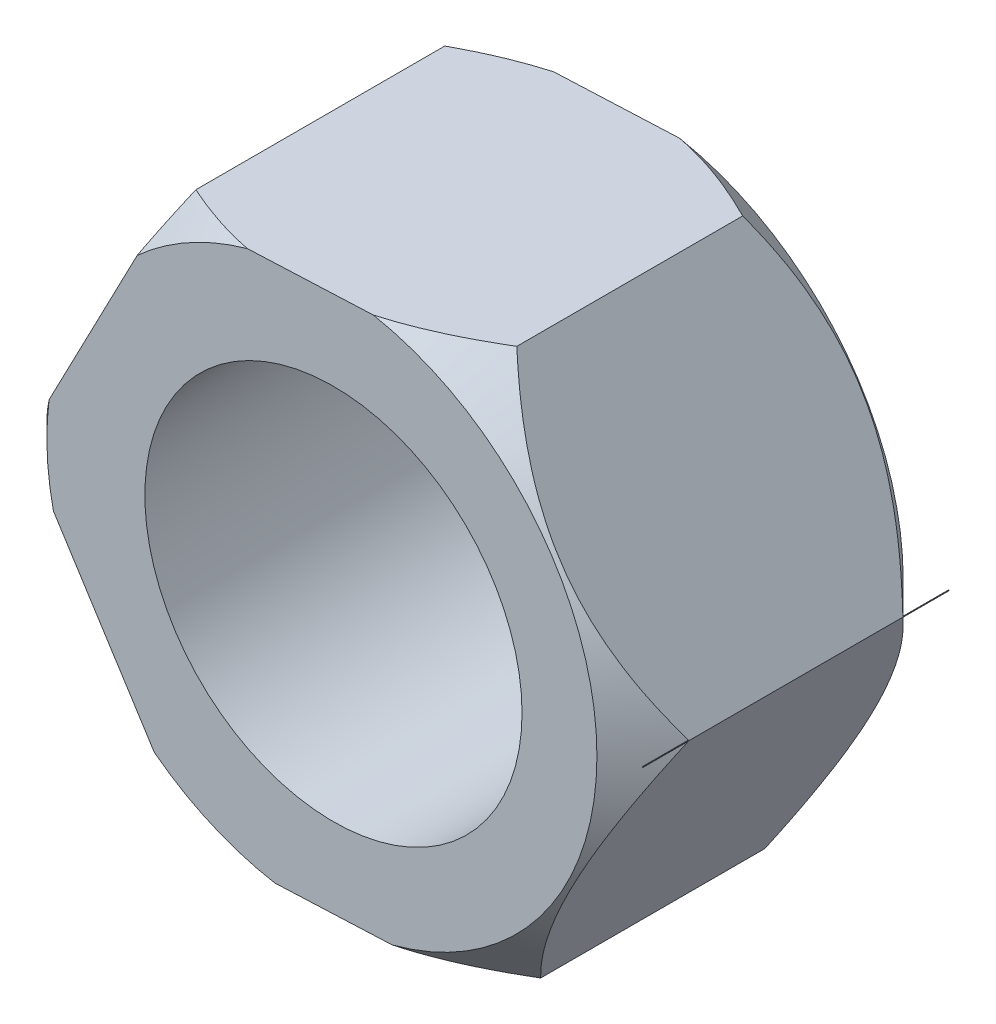
ISO-10303-21;
HEADER;
FILE_DESCRIPTION(('STEP AP214'),'2;1');
FILE_NAME('part.step','',(''),(''),'','','');
FILE_SCHEMA(('AUTOMOTIVE_DESIGN { 1 0 10303 214 1 1 1 1 }'));
ENDSEC;
DATA;
#1=APPLICATION_CONTEXT('core data for automotive mechanical design processes');
#2=APPLICATION_PROTOCOL_DEFINITION('international standard','automotive_design',2000,#1);
#3=PRODUCT_CONTEXT('',#1,'mechanical');
#4=PRODUCT('Part','Part','',(#3));
#5=PRODUCT_RELATED_PRODUCT_CATEGORY('part','',(#4));
#6=PRODUCT_DEFINITION_FORMATION('','',#4);
#7=PRODUCT_DEFINITION_CONTEXT('part definition',#1,'design');
#8=PRODUCT_DEFINITION('design','',#6,#7);
#9=PRODUCT_DEFINITION_SHAPE('','',#8);
#10=(LENGTH_UNIT() NAMED_UNIT(*) SI_UNIT(.MILLI.,.METRE.));
#11=(NAMED_UNIT(*) PLANE_ANGLE_UNIT() SI_UNIT($,.RADIAN.));
#12=(NAMED_UNIT(*) SI_UNIT($,.STERADIAN.) SOLID_ANGLE_UNIT());
#13=UNCERTAINTY_MEASURE_WITH_UNIT(LENGTH_MEASURE(1.E-05),#10,'distance_accuracy_value','');
#14=(GEOMETRIC_REPRESENTATION_CONTEXT(3) GLOBAL_UNCERTAINTY_ASSIGNED_CONTEXT((#13)) GLOBAL_UNIT_ASSIGNED_CONTEXT((#10,
#11,#12)) REPRESENTATION_CONTEXT('',''));
#15=CARTESIAN_POINT('',(0.,0.,0.));
#16=DIRECTION('',(0.,0.,1.));
#17=DIRECTION('',(1.,0.,0.));
#18=AXIS2_PLACEMENT_3D('',#15,#16,#17);
#19=CARTESIAN_POINT('',(0.,0.,0.2));
#20=DIRECTION('',(0.,0.,1.));
#21=DIRECTION('',(1.,0.,0.));
#22=AXIS2_PLACEMENT_3D('',#19,#20,#21);
#23=PLANE('',#22);
#24=DIRECTION('',(-0.536795426051576,0.843712433575627,0.));
#25=VECTOR('',#24,1.);
#26=CARTESIAN_POINT('',(0.202072594216369,0.00870167620666327,0.2));
#27=LINE('',#26,#25);
#28=CARTESIAN_POINT('',(0.202072594216369,0.00870167620666327,0.2));
#29=VERTEX_POINT('',#28);
#30=CARTESIAN_POINT('',(0.201879033774588,0.00900590635366816,0.2));
#31=VERTEX_POINT('',#30);
#32=EDGE_CURVE('E206',#29,#31,#27,.T.);
#33=ORIENTED_EDGE('',*,*,#32,.T.);
#34=CARTESIAN_POINT('',(-0.00753587265047697,0.,0.2));
#35=DIRECTION('',(0.,0.,-1.));
#36=DIRECTION('',(-1.,0.,0.));
#37=AXIS2_PLACEMENT_3D('',#34,#35,#36);
#38=CIRCLE('',#37,0.209608466866846);
#39=CARTESIAN_POINT('',(0.201905005529297,0.00838021059132095,0.2));
#40=VERTEX_POINT('',#39);
#41=EDGE_CURVE('E379',#31,#40,#38,.T.);
#42=ORIENTED_EDGE('',*,*,#41,.T.);
#43=DIRECTION('',(0.462278687939496,0.886734692383769,0.));
#44=VECTOR('',#43,1.);
#45=CARTESIAN_POINT('',(0.108572169758661,-0.170649161896668,0.2));
#46=LINE('',#45,#44);
#47=EDGE_CURVE('E204',#40,#29,#46,.T.);
#48=ORIENTED_EDGE('',*,*,#47,.T.);
#49=EDGE_LOOP('',(#33,#42,#48));
#50=FACE_BOUND('',#49,.T.);
#51=ADVANCED_FACE('F36',(#50),#23,.T.);
#52=CARTESIAN_POINT('',(0.,0.,0.2));
#53=DIRECTION('',(0.,0.,1.));
#54=DIRECTION('',(1.,0.,0.));
#55=AXIS2_PLACEMENT_3D('',#52,#53,#54);
#56=CIRCLE('',#55,0.123170064862239);
#57=CARTESIAN_POINT('',(0.123170064862239,0.,0.2));
#58=VERTEX_POINT('',#57);
#59=EDGE_CURVE('E214',#58,#58,#56,.T.);
#60=ORIENTED_EDGE('',*,*,#59,.F.);
#61=EDGE_LOOP('',(#60));
#62=FACE_BOUND('',#61,.T.);
#63=DIRECTION('',(-0.999074113991072,-0.0430222588081423,0.));
#64=VECTOR('',#63,1.);
#65=CARTESIAN_POINT('',(0.0935004244577075,0.179350838103332,0.2));
#66=LINE('',#65,#64);
#67=CARTESIAN_POINT('',(0.0260245099685869,0.176445181540106,0.2));
#68=VERTEX_POINT('',#67);
#69=CARTESIAN_POINT('',(-0.0561401040547646,0.17290699829636,0.2));
#70=VERTEX_POINT('',#69);
#71=EDGE_CURVE('E194',#68,#70,#66,.T.);
#72=ORIENTED_EDGE('',*,*,#71,.T.);
#73=CARTESIAN_POINT('',(-0.00753587265047697,0.,0.2));
#74=DIRECTION('',(0.,0.,-1.));
#75=DIRECTION('',(-1.,0.,0.));
#76=AXIS2_PLACEMENT_3D('',#73,#74,#75);
#77=CIRCLE('',#76,0.179608466866846);
#78=CARTESIAN_POINT('',(-0.128160880075446,0.133074448914828,0.2));
#79=VERTEX_POINT('',#78);
#80=EDGE_CURVE('E179',#79,#70,#77,.T.);
#81=ORIENTED_EDGE('',*,*,#80,.F.);
#82=DIRECTION('',(-0.462278687939496,-0.886734692383769,0.));
#83=VECTOR('',#82,1.);
#84=CARTESIAN_POINT('',(-0.108572169758661,0.170649161896668,0.2));
#85=LINE('',#84,#83);
#86=CARTESIAN_POINT('',(-0.185704739763984,0.0226948487932463,0.2));
#87=VERTEX_POINT('',#86);
#88=EDGE_CURVE('E185',#79,#87,#85,.T.);
#89=ORIENTED_EDGE('',*,*,#88,.T.);
#90=CARTESIAN_POINT('',(-0.18289283517902,-0.0388476133503999,0.2));
#91=VERTEX_POINT('',#90);
#92=EDGE_CURVE('E167',#91,#87,#77,.T.);
#93=ORIENTED_EDGE('',*,*,#92,.F.);
#94=DIRECTION('',(0.536795426051576,-0.843712433575627,0.));
#95=VECTOR('',#94,1.);
#96=CARTESIAN_POINT('',(-0.202072594216369,-0.0087016762066633,0.2));
#97=LINE('',#96,#95);
#98=CARTESIAN_POINT('',(-0.117023096796865,-0.14237889281413,0.2));
#99=VERTEX_POINT('',#98);
#100=EDGE_CURVE('E193',#91,#99,#97,.T.);
#101=ORIENTED_EDGE('',*,*,#100,.T.);
#102=CARTESIAN_POINT('',(-0.038209328579222,-0.176969885776214,0.2));
#103=VERTEX_POINT('',#102);
#104=EDGE_CURVE('E177',#103,#99,#77,.T.);
#105=ORIENTED_EDGE('',*,*,#104,.F.);
#106=DIRECTION('',(0.999074113991072,0.0430222588081422,0.));
#107=VECTOR('',#106,1.);
#108=CARTESIAN_POINT('',(-0.0935004244577075,-0.179350838103332,0.2));
#109=LINE('',#108,#107);
#110=CARTESIAN_POINT('',(0.0382372250949524,-0.17367793438732,0.2));
#111=VERTEX_POINT('',#110);
#112=EDGE_CURVE('E196',#103,#111,#109,.T.);
#113=ORIENTED_EDGE('',*,*,#112,.T.);
#114=EDGE_CURVE('E387',#68,#111,#77,.T.);
#115=ORIENTED_EDGE('',*,*,#114,.F.);
#116=EDGE_LOOP('',(#72,#81,#89,#93,#101,#105,#113,#115));
#117=FACE_BOUND('',#116,.T.);
#118=ADVANCED_FACE('F192',(#62,#117),#23,.T.);
#119=CARTESIAN_POINT('',(0.,0.,0.));
#120=DIRECTION('',(0.,0.,1.));
#121=DIRECTION('',(1.,0.,0.));
#122=AXIS2_PLACEMENT_3D('',#119,#120,#121);
#123=PLANE('',#122);
#124=CARTESIAN_POINT('',(-0.00753587265047697,0.,0.));
#125=DIRECTION('',(0.,0.,-1.));
#126=DIRECTION('',(-1.,0.,0.));
#127=AXIS2_PLACEMENT_3D('',#124,#125,#126);
#128=CIRCLE('',#127,0.179608466866846);
#129=CARTESIAN_POINT('',(-0.128160880075446,0.133074448914828,0.));
#130=VERTEX_POINT('',#129);
#131=CARTESIAN_POINT('',(-0.0561401040547646,0.17290699829636,0.));
#132=VERTEX_POINT('',#131);
#133=EDGE_CURVE('E66',#130,#132,#128,.T.);
#134=ORIENTED_EDGE('',*,*,#133,.T.);
#135=DIRECTION('',(-0.999074113991072,-0.0430222588081423,0.));
#136=VECTOR('',#135,1.);
#137=CARTESIAN_POINT('',(0.0935004244577075,0.179350838103332,0.));
#138=LINE('',#137,#136);
#139=CARTESIAN_POINT('',(0.0260245099685869,0.176445181540106,0.));
#140=VERTEX_POINT('',#139);
#141=EDGE_CURVE('E210',#140,#132,#138,.T.);
#142=ORIENTED_EDGE('',*,*,#141,.F.);
#143=CARTESIAN_POINT('',(0.0382372250949524,-0.17367793438732,0.));
#144=VERTEX_POINT('',#143);
#145=EDGE_CURVE('E364',#140,#144,#128,.T.);
#146=ORIENTED_EDGE('',*,*,#145,.T.);
#147=DIRECTION('',(0.999074113991072,0.0430222588081422,0.));
#148=VECTOR('',#147,1.);
#149=CARTESIAN_POINT('',(-0.0935004244577075,-0.179350838103332,0.));
#150=LINE('',#149,#148);
#151=CARTESIAN_POINT('',(-0.038209328579222,-0.176969885776214,0.));
#152=VERTEX_POINT('',#151);
#153=EDGE_CURVE('E220',#152,#144,#150,.T.);
#154=ORIENTED_EDGE('',*,*,#153,.F.);
#155=CARTESIAN_POINT('',(-0.117023096796865,-0.14237889281413,0.));
#156=VERTEX_POINT('',#155);
#157=EDGE_CURVE('E371',#152,#156,#128,.T.);
#158=ORIENTED_EDGE('',*,*,#157,.T.);
#159=DIRECTION('',(0.536795426051576,-0.843712433575627,0.));
#160=VECTOR('',#159,1.);
#161=CARTESIAN_POINT('',(-0.202072594216369,-0.0087016762066633,0.));
#162=LINE('',#161,#160);
#163=CARTESIAN_POINT('',(-0.18289283517902,-0.0388476133503999,0.));
#164=VERTEX_POINT('',#163);
#165=EDGE_CURVE('E217',#164,#156,#162,.T.);
#166=ORIENTED_EDGE('',*,*,#165,.F.);
#167=CARTESIAN_POINT('',(-0.185704739763984,0.0226948487932463,0.));
#168=VERTEX_POINT('',#167);
#169=EDGE_CURVE('E366',#164,#168,#128,.T.);
#170=ORIENTED_EDGE('',*,*,#169,.T.);
#171=DIRECTION('',(-0.462278687939496,-0.886734692383769,0.));
#172=VECTOR('',#171,1.);
#173=CARTESIAN_POINT('',(-0.108572169758661,0.170649161896668,0.));
#174=LINE('',#173,#172);
#175=EDGE_CURVE('E213',#130,#168,#174,.T.);
#176=ORIENTED_EDGE('',*,*,#175,.F.);
#177=EDGE_LOOP('',(#134,#142,#146,#154,#158,#166,#170,#176));
#178=FACE_BOUND('',#177,.T.);
#179=CARTESIAN_POINT('',(0.,0.,0.));
#180=DIRECTION('',(0.,0.,1.));
#181=DIRECTION('',(1.,0.,0.));
#182=AXIS2_PLACEMENT_3D('',#179,#180,#181);
#183=CIRCLE('',#182,0.123170064862239);
#184=CARTESIAN_POINT('',(0.123170064862239,0.,0.));
#185=VERTEX_POINT('',#184);
#186=EDGE_CURVE('E335',#185,#185,#183,.T.);
#187=ORIENTED_EDGE('',*,*,#186,.T.);
#188=EDGE_LOOP('',(#187));
#189=FACE_BOUND('',#188,.T.);
#190=ADVANCED_FACE('F407',(#178,#189),#123,.F.);
#191=CARTESIAN_POINT('',(0.0935004244577075,0.179350838103332,0.2));
#192=DIRECTION('',(0.0430222588081423,-0.999074113991072,0.));
#193=DIRECTION('',(0.999074113991072,0.0430222588081423,0.));
#194=AXIS2_PLACEMENT_3D('',#191,#192,#193);
#195=PLANE('',#194);
#196=CARTESIAN_POINT('',(-0.109272169758661,0.170619018406066,0.0190397739789627));
#197=CARTESIAN_POINT('',(-0.102697727249426,0.170902127900338,0.015923146117006));
#198=CARTESIAN_POINT('',(-0.0960285716704873,0.171189315941075,0.0130023216380583));
#199=CARTESIAN_POINT('',(-0.0824505838982588,0.17177401300794,0.00768311994520581));
#200=CARTESIAN_POINT('',(-0.0755407575816301,0.172071564843134,0.0052873094209994));
#201=CARTESIAN_POINT('',(-0.0547446941325046,0.172967087619042,-0.000791079846926271));
#202=CARTESIAN_POINT('',(-0.0405350130799409,0.173578986743705,-0.00349791564524525));
#203=CARTESIAN_POINT('',(-0.0153039123863762,0.174665491667465,-0.00511236620426449));
#204=CARTESIAN_POINT('',(-0.0043297008095443,0.175138064586793,-0.00477165556773154));
#205=CARTESIAN_POINT('',(0.0173966701780418,0.176073648386333,-0.00210815107413106));
#206=CARTESIAN_POINT('',(0.0281480457367236,0.176536625512205,0.000220715816779837));
#207=CARTESIAN_POINT('',(0.0483353840079148,0.177405935285713,0.00615397093765494));
#208=CARTESIAN_POINT('',(0.0578078588756172,0.177813840224501,0.00964177269505348));
#209=CARTESIAN_POINT('',(0.0763150230900641,0.178610798125309,0.017531697903543));
#210=CARTESIAN_POINT('',(0.0853516591333504,0.178999934916229,0.0219291775378391));
#211=CARTESIAN_POINT('',(0.0942004244577075,0.179380981593934,0.0266142542549739));
#212=B_SPLINE_CURVE_WITH_KNOTS('',3,(#196,#197,#198,#199,#200,#201,#202,#203,#204,#205,#206,
#207,#208,#209,#210,#211),.UNSPECIFIED.,.F.,.F.,(4,2,2,2,2,2,2,4),(0.,0.0218386614149191,
0.0437818170029638,0.0868106643739193,0.119585171218909,0.152460150954603,0.182712315000461,
0.212813695898949),.UNSPECIFIED.);
#213=CARTESIAN_POINT('',(-0.108572169759128,0.170649161895774,0.018708122930881));
#214=VERTEX_POINT('',#213);
#215=EDGE_CURVE('E337',#214,#132,#212,.T.);
#216=ORIENTED_EDGE('',*,*,#215,.F.);
#217=DIRECTION('',(0.,0.,-1.));
#218=VECTOR('',#217,1.);
#219=CARTESIAN_POINT('',(-0.108572169758661,0.170649161896668,0.2));
#220=LINE('',#219,#218);
#221=CARTESIAN_POINT('',(-0.108572169758661,0.170649161896668,0.181291877068189));
#222=VERTEX_POINT('',#221);
#223=EDGE_CURVE('E239',#222,#214,#220,.T.);
#224=ORIENTED_EDGE('',*,*,#223,.F.);
#225=CARTESIAN_POINT('',(0.0942004244577075,0.179380981593934,0.173385745745026));
#226=CARTESIAN_POINT('',(0.0820041190917782,0.178855782713682,0.179858207053099));
#227=CARTESIAN_POINT('',(0.0693533842201855,0.178311015131241,0.185803002029775));
#228=CARTESIAN_POINT('',(0.0433430664501388,0.177190955460878,0.195648980062667));
#229=CARTESIAN_POINT('',(0.0299854499761043,0.176615748051379,0.199555534706058));
#230=CARTESIAN_POINT('',(0.00602077718824567,0.17558377821001,0.203793240926226));
#231=CARTESIAN_POINT('',(-0.00446316853564499,0.175132317182297,0.204763761337246));
#232=CARTESIAN_POINT('',(-0.0254172029778356,0.174229991839039,0.204777153440971));
#233=CARTESIAN_POINT('',(-0.0358872907391198,0.173779127564706,0.203822697925552));
#234=CARTESIAN_POINT('',(-0.0571208595008257,0.172864764878401,0.200097737682529));
#235=CARTESIAN_POINT('',(-0.0678643704075361,0.17240212642119,0.197221915936624));
#236=CARTESIAN_POINT('',(-0.0889277891094616,0.171495090758782,0.190040767557528));
#237=CARTESIAN_POINT('',(-0.0992456014627963,0.171050783787775,0.1857291429047));
#238=CARTESIAN_POINT('',(-0.109272169758661,0.170619018406066,0.180960226021037));
#239=B_SPLINE_CURVE_WITH_KNOTS('',3,(#225,#226,#227,#228,#229,#230,#231,#232,#233,#234,#235,
#236,#237,#238),.UNSPECIFIED.,.F.,.F.,(4,2,2,2,2,2,4),(0.,0.0416853075740128,0.0832601954292579,
0.114701985134763,0.146100148578229,0.17937832889744,0.212804447106579),.UNSPECIFIED.);
#240=EDGE_CURVE('E58',#70,#222,#239,.T.);
#241=ORIENTED_EDGE('',*,*,#240,.F.);
#242=ORIENTED_EDGE('',*,*,#71,.F.);
#243=CARTESIAN_POINT('',(0.0935004244577127,0.179350838103323,0.173756441222944));
#244=VERTEX_POINT('',#243);
#245=EDGE_CURVE('E270',#244,#68,#239,.T.);
#246=ORIENTED_EDGE('',*,*,#245,.F.);
#247=DIRECTION('',(0.,0.,-1.));
#248=VECTOR('',#247,1.);
#249=CARTESIAN_POINT('',(0.0935004244577075,0.179350838103332,0.2));
#250=LINE('',#249,#248);
#251=CARTESIAN_POINT('',(0.0935004244577127,0.179350838103323,0.0262435587770558));
#252=VERTEX_POINT('',#251);
#253=EDGE_CURVE('E209',#244,#252,#250,.T.);
#254=ORIENTED_EDGE('',*,*,#253,.T.);
#255=EDGE_CURVE('E341',#140,#252,#212,.T.);
#256=ORIENTED_EDGE('',*,*,#255,.F.);
#257=ORIENTED_EDGE('',*,*,#141,.T.);
#258=EDGE_LOOP('',(#216,#224,#241,#242,#246,#254,#256,#257));
#259=FACE_BOUND('',#258,.T.);
#260=ADVANCED_FACE('F38',(#259),#195,.F.);
#261=CARTESIAN_POINT('',(-0.108572169758661,0.170649161896668,0.2));
#262=DIRECTION('',(0.886734692383769,-0.462278687939496,0.));
#263=DIRECTION('',(0.462278687939496,0.886734692383769,0.));
#264=AXIS2_PLACEMENT_3D('',#261,#262,#263);
#265=PLANE('',#264);
#266=CARTESIAN_POINT('',(-0.202437523077659,-0.0094016762066633,0.0155198110805963));
#267=CARTESIAN_POINT('',(-0.199306559636723,-0.00339591826000655,0.0121134081795441));
#268=CARTESIAN_POINT('',(-0.196129534593343,0.00269819422675795,0.00890168171537635));
#269=CARTESIAN_POINT('',(-0.189649197806461,0.0151286600846415,0.00301673362041555));
#270=CARTESIAN_POINT('',(-0.18634524054005,0.0214662516862332,0.000346872895346435));
#271=CARTESIAN_POINT('',(-0.176390265397244,0.0405617065519772,-0.00646670496566751));
#272=CARTESIAN_POINT('',(-0.169564864666388,0.0536540678815644,-0.00957225981587039));
#273=CARTESIAN_POINT('',(-0.157793806632857,0.0762331003931419,-0.0114499714021075));
#274=CARTESIAN_POINT('',(-0.152881957869576,0.0856549206409169,-0.011223563469836));
#275=CARTESIAN_POINT('',(-0.14315363350918,0.104315618038792,-0.00883339838106632));
#276=CARTESIAN_POINT('',(-0.138337416940233,0.113553998325702,-0.00666496295305603));
#277=CARTESIAN_POINT('',(-0.129197932844061,0.131085192884309,-0.00100395070496935));
#278=CARTESIAN_POINT('',(-0.124862396967948,0.139401540082922,0.00240193768771786));
#279=CARTESIAN_POINT('',(-0.116391069431658,0.155651088705758,0.0101528510923829));
#280=CARTESIAN_POINT('',(-0.112254579456898,0.1635856296245,0.0144942472556838));
#281=CARTESIAN_POINT('',(-0.108207240897372,0.171349161896668,0.0191256763179439));
#282=B_SPLINE_CURVE_WITH_KNOTS('',3,(#266,#267,#268,#269,#270,#271,#272,#273,#274,#275,#276,
#277,#278,#279,#280,#281),.UNSPECIFIED.,.F.,.F.,(4,2,2,2,2,2,2,4),(0.,0.0227371373554381,
0.0456112591260085,0.0903976253808209,0.122090811711525,0.153860551713882,0.183735470907046,
0.21349652647974),.UNSPECIFIED.);
#283=CARTESIAN_POINT('',(-0.202072594215556,-0.00870167620794102,0.0151227715257288));
#284=VERTEX_POINT('',#283);
#285=EDGE_CURVE('E327',#284,#168,#282,.T.);
#286=ORIENTED_EDGE('',*,*,#285,.F.);
#287=DIRECTION('',(0.,0.,-1.));
#288=VECTOR('',#287,1.);
#289=CARTESIAN_POINT('',(-0.202072594216369,-0.0087016762066633,0.2));
#290=LINE('',#289,#288);
#291=CARTESIAN_POINT('',(-0.202072594216369,-0.0087016762066633,0.184877228472974));
#292=VERTEX_POINT('',#291);
#293=EDGE_CURVE('E187',#292,#284,#290,.T.);
#294=ORIENTED_EDGE('',*,*,#293,.F.);
#295=CARTESIAN_POINT('',(-0.108207240897372,0.171349161896668,0.180874323682056));
#296=CARTESIAN_POINT('',(-0.113649820128107,0.160909303980112,0.187117411534094));
#297=CARTESIAN_POINT('',(-0.119295349865002,0.150080150040737,0.192851370079535));
#298=CARTESIAN_POINT('',(-0.130894206144206,0.127831431847417,0.202339156470204));
#299=CARTESIAN_POINT('',(-0.136846155481925,0.11641450932263,0.206101117366853));
#300=CARTESIAN_POINT('',(-0.147525687506768,0.0959292224341894,0.210184443165809));
#301=CARTESIAN_POINT('',(-0.15219848379819,0.0869659483526728,0.211120552676129));
#302=CARTESIAN_POINT('',(-0.16154146522311,0.0690444088659585,0.211136550440887));
#303=CARTESIAN_POINT('',(-0.166211649978997,0.060086144185091,0.210217696767206));
#304=CARTESIAN_POINT('',(-0.176316965880224,0.0407023083715561,0.206388298856163));
#305=CARTESIAN_POINT('',(-0.181720607695415,0.0303371395075038,0.203119634723376));
#306=CARTESIAN_POINT('',(-0.192285456203294,0.010071836485484,0.194895527250673));
#307=CARTESIAN_POINT('',(-0.19744527017796,0.000174373814261958,0.189931478927276));
#308=CARTESIAN_POINT('',(-0.202437523077659,-0.00940167620666329,0.184480188919404));
#309=B_SPLINE_CURVE_WITH_KNOTS('',3,(#295,#296,#297,#298,#299,#300,#301,#302,#303,#304,#305,
#306,#307,#308),.UNSPECIFIED.,.F.,.F.,(4,2,2,2,2,2,4),(0.,0.0402038520790847,0.0802405614615708,
0.110527968468964,0.140794840872645,0.177050610691878,0.213493202203129),.UNSPECIFIED.);
#310=EDGE_CURVE('E170',#87,#292,#309,.T.);
#311=ORIENTED_EDGE('',*,*,#310,.F.);
#312=ORIENTED_EDGE('',*,*,#88,.F.);
#313=EDGE_CURVE('E188',#222,#79,#309,.T.);
#314=ORIENTED_EDGE('',*,*,#313,.F.);
#315=ORIENTED_EDGE('',*,*,#223,.T.);
#316=EDGE_CURVE('E333',#130,#214,#282,.T.);
#317=ORIENTED_EDGE('',*,*,#316,.F.);
#318=ORIENTED_EDGE('',*,*,#175,.T.);
#319=EDGE_LOOP('',(#286,#294,#311,#312,#314,#315,#317,#318));
#320=FACE_BOUND('',#319,.T.);
#321=ADVANCED_FACE('F184',(#320),#265,.F.);
#322=CARTESIAN_POINT('',(-0.202072594216369,-0.0087016762066633,0.2));
#323=DIRECTION('',(0.843712433575627,0.536795426051576,0.));
#324=DIRECTION('',(-0.536795426051576,0.843712433575627,0.));
#325=AXIS2_PLACEMENT_3D('',#322,#323,#324);
#326=PLANE('',#325);
#327=CARTESIAN_POINT('',(-0.0930550632383124,-0.180050838103332,0.019719996380405));
#328=CARTESIAN_POINT('',(-0.0993949885912791,-0.170086010557045,0.0134410851729283));
#329=CARTESIAN_POINT('',(-0.105970985302658,-0.159750135996128,0.00766937489679667));
#330=CARTESIAN_POINT('',(-0.119484487035419,-0.138510183344258,-0.00189243890737754));
#331=CARTESIAN_POINT('',(-0.126420494003895,-0.127608459829744,-0.0056901272895821));
#332=CARTESIAN_POINT('',(-0.138856406524202,-0.108062216499357,-0.0098225947542494));
#333=CARTESIAN_POINT('',(-0.144291505945664,-0.0995195562286896,-0.0107780890233266));
#334=CARTESIAN_POINT('',(-0.155159813188665,-0.0824372088244127,-0.0108295937781795));
#335=CARTESIAN_POINT('',(-0.160593018970131,-0.0738975248973046,-0.00992711151092986));
#336=CARTESIAN_POINT('',(-0.172308207942364,-0.0554840844731462,-0.00614055626574804));
#337=CARTESIAN_POINT('',(-0.178555420812435,-0.0456649785011704,-0.00291269643769194));
#338=CARTESIAN_POINT('',(-0.190773159085613,-0.0264616522599699,0.00522051165011736));
#339=CARTESIAN_POINT('',(-0.196742035722192,-0.0170800234525049,0.010134692687215));
#340=CARTESIAN_POINT('',(-0.202517955435764,-0.00800167620666328,0.015537733273984));
#341=B_SPLINE_CURVE_WITH_KNOTS('',3,(#327,#328,#329,#330,#331,#332,#333,#334,#335,#336,#337,
#338,#339,#340),.UNSPECIFIED.,.F.,.F.,(4,2,2,2,2,2,4),(0.,0.0403547377161185,0.0805532509617782,
0.110896635835098,0.141215414933139,0.177292250020897,0.213561011567433),.UNSPECIFIED.);
#342=CARTESIAN_POINT('',(-0.0935004244568833,-0.179350838103296,0.0192800126776573));
#343=VERTEX_POINT('',#342);
#344=EDGE_CURVE('E312',#343,#156,#341,.T.);
#345=ORIENTED_EDGE('',*,*,#344,.F.);
#346=DIRECTION('',(0.,0.,-1.));
#347=VECTOR('',#346,1.);
#348=CARTESIAN_POINT('',(-0.0935004244577075,-0.179350838103332,0.2));
#349=LINE('',#348,#347);
#350=CARTESIAN_POINT('',(-0.0935004244577075,-0.179350838103332,0.180719987321686));
#351=VERTEX_POINT('',#350);
#352=EDGE_CURVE('E235',#351,#343,#349,.T.);
#353=ORIENTED_EDGE('',*,*,#352,.F.);
#354=CARTESIAN_POINT('',(-0.202517955435764,-0.00800167620666329,0.184462266726016));
#355=CARTESIAN_POINT('',(-0.198898317258926,-0.0136908709848435,0.187835628232466));
#356=CARTESIAN_POINT('',(-0.195225504861268,-0.0194636427628887,0.191014524191375));
#357=CARTESIAN_POINT('',(-0.187735242905619,-0.0312365209135168,0.196836274842197));
#358=CARTESIAN_POINT('',(-0.183917068210816,-0.0372377670255868,0.199475858338287));
#359=CARTESIAN_POINT('',(-0.172414584390459,-0.0553168864540482,0.206208940561848));
#360=CARTESIAN_POINT('',(-0.164530995109701,-0.067707979922008,0.209272468934547));
#361=CARTESIAN_POINT('',(-0.150898057684326,-0.0891356565632807,0.211127270992262));
#362=CARTESIAN_POINT('',(-0.145186538336127,-0.0981127820282436,0.210893383693062));
#363=CARTESIAN_POINT('',(-0.133874308660888,-0.115892868007489,0.208487321735728));
#364=CARTESIAN_POINT('',(-0.128273914646624,-0.124695331354678,0.206310252929956));
#365=CARTESIAN_POINT('',(-0.11761278446586,-0.141452046581633,0.200614435294793));
#366=CARTESIAN_POINT('',(-0.112539207050283,-0.149426481795654,0.197173716615474));
#367=CARTESIAN_POINT('',(-0.102627749881379,-0.165004892568947,0.189343376666818));
#368=CARTESIAN_POINT('',(-0.0977890168058103,-0.172610209344166,0.18495756461792));
#369=CARTESIAN_POINT('',(-0.0930550632383123,-0.180050838103332,0.180280003619595));
#370=B_SPLINE_CURVE_WITH_KNOTS('',3,(#354,#355,#356,#357,#358,#359,#360,#361,#362,#363,#364,
#365,#366,#367,#368,#369),.UNSPECIFIED.,.F.,.F.,(4,2,2,2,2,2,2,4),(0.,0.0226128598639487,
0.0453590526069063,0.0898980321806379,0.121635858783018,0.153453847371421,0.183569190586798,
0.213565350771204),.UNSPECIFIED.);
#371=EDGE_CURVE('E291',#99,#351,#370,.T.);
#372=ORIENTED_EDGE('',*,*,#371,.F.);
#373=ORIENTED_EDGE('',*,*,#100,.F.);
#374=EDGE_CURVE('E172',#292,#91,#370,.T.);
#375=ORIENTED_EDGE('',*,*,#374,.F.);
#376=ORIENTED_EDGE('',*,*,#293,.T.);
#377=EDGE_CURVE('E319',#164,#284,#341,.T.);
#378=ORIENTED_EDGE('',*,*,#377,.F.);
#379=ORIENTED_EDGE('',*,*,#165,.T.);
#380=EDGE_LOOP('',(#345,#353,#372,#373,#375,#376,#378,#379));
#381=FACE_BOUND('',#380,.T.);
#382=ADVANCED_FACE('F303',(#381),#326,.F.);
#383=CARTESIAN_POINT('',(-0.0935004244577075,-0.179350838103332,0.2));
#384=DIRECTION('',(-0.0430222588081422,0.999074113991072,0.));
#385=DIRECTION('',(-0.999074113991072,-0.0430222588081422,0.));
#386=AXIS2_PLACEMENT_3D('',#383,#384,#385);
#387=PLANE('',#386);
#388=CARTESIAN_POINT('',(0.109272169758661,-0.170619018406066,0.0271642784679895));
#389=CARTESIAN_POINT('',(0.0970468434332777,-0.17114546699063,0.0206927264330644));
#390=CARTESIAN_POINT('',(0.0843654402885855,-0.171691555214217,0.0147536277190308));
#391=CARTESIAN_POINT('',(0.0582950721561476,-0.172814200781058,0.00492741426959529));
#392=CARTESIAN_POINT('',(0.0449081268572489,-0.173390671152209,0.00103475870041739));
#393=CARTESIAN_POINT('',(0.0208735939673464,-0.174425649318334,-0.00317710441468487));
#394=CARTESIAN_POINT('',(0.0103476062194419,-0.174878920765127,-0.00413335672034767));
#395=CARTESIAN_POINT('',(-0.0106871901990248,-0.17578472389106,-0.00411060350064554));
#396=CARTESIAN_POINT('',(-0.0211960027853933,-0.176237255738823,-0.00313422458545057));
#397=CARTESIAN_POINT('',(-0.0423918620182286,-0.177149994572515,0.000618890282075781));
#398=CARTESIAN_POINT('',(-0.0530625235699614,-0.177609495981374,0.0034812726756965));
#399=CARTESIAN_POINT('',(-0.0739852909944279,-0.178510474900267,0.0106114066765268));
#400=CARTESIAN_POINT('',(-0.0842354411956962,-0.178951868194924,0.0148850361725314));
#401=CARTESIAN_POINT('',(-0.0942004244577075,-0.179380981593934,0.0196107116716453));
#402=B_SPLINE_CURVE_WITH_KNOTS('',3,(#388,#389,#390,#391,#392,#393,#394,#395,#396,#397,#398,
#399,#400,#401),.UNSPECIFIED.,.F.,.F.,(4,2,2,2,2,2,4),(0.,0.0417606707138395,0.0834076825732605,
0.114970203633523,0.146489857996649,0.179549782771175,0.212749177468129),.UNSPECIFIED.);
#403=CARTESIAN_POINT('',(0.108572169758665,-0.170649161896661,0.0267945708242573));
#404=VERTEX_POINT('',#403);
#405=EDGE_CURVE('E321',#404,#144,#402,.T.);
#406=ORIENTED_EDGE('',*,*,#405,.F.);
#407=DIRECTION('',(0.,0.,-1.));
#408=VECTOR('',#407,1.);
#409=CARTESIAN_POINT('',(0.108572169758661,-0.170649161896668,0.2));
#410=LINE('',#409,#408);
#411=CARTESIAN_POINT('',(0.108572169758665,-0.170649161896661,0.173205429175743));
#412=VERTEX_POINT('',#411);
#413=EDGE_CURVE('E232',#412,#404,#410,.T.);
#414=ORIENTED_EDGE('',*,*,#413,.F.);
#415=CARTESIAN_POINT('',(-0.0942004244577075,-0.179380981593934,0.180389288328355));
#416=CARTESIAN_POINT('',(-0.0876203604171736,-0.179097630024554,0.183499728005745));
#417=CARTESIAN_POINT('',(-0.0809456198436143,-0.178810201482055,0.186413906487374));
#418=CARTESIAN_POINT('',(-0.0673573546653686,-0.178225061848203,0.191719403945603));
#419=CARTESIAN_POINT('',(-0.0604428488967878,-0.177927308505842,0.194108181310734));
#420=CARTESIAN_POINT('',(-0.0396326450120761,-0.177031176812667,0.200167052139219));
#421=CARTESIAN_POINT('',(-0.0254149953943309,-0.176418934544619,0.202861731170704));
#422=CARTESIAN_POINT('',(-0.000136848567469299,-0.175330403714177,0.204465314989858));
#423=CARTESIAN_POINT('',(0.0108774079068056,-0.174856106376293,0.204117199116369));
#424=CARTESIAN_POINT('',(0.0326818739196681,-0.173917159638667,0.201432680861573));
#425=CARTESIAN_POINT('',(0.0434712989905148,-0.173452544019776,0.199090226554454));
#426=CARTESIAN_POINT('',(0.0636419906658844,-0.172583951084133,0.193152788721078));
#427=CARTESIAN_POINT('',(0.0730635715925155,-0.172178237746823,0.189686338050516));
#428=CARTESIAN_POINT('',(0.0914746190954144,-0.171385418836287,0.181850701325189));
#429=CARTESIAN_POINT('',(0.100466006801482,-0.170998230535122,0.17748610478642));
#430=CARTESIAN_POINT('',(0.109272169758661,-0.170619018406066,0.17283572153201));
#431=B_SPLINE_CURVE_WITH_KNOTS('',3,(#415,#416,#417,#418,#419,#420,#421,#422,#423,#424,#425,
#426,#427,#428,#429,#430),.UNSPECIFIED.,.F.,.F.,(4,2,2,2,2,2,2,4),(0.,0.0218460227458029,
0.0437955076487111,0.0868429107817752,0.119737642017498,0.152732551309417,0.182820533509908,
0.212758423177107),.UNSPECIFIED.);
#432=EDGE_CURVE('E284',#111,#412,#431,.T.);
#433=ORIENTED_EDGE('',*,*,#432,.F.);
#434=ORIENTED_EDGE('',*,*,#112,.F.);
#435=EDGE_CURVE('E297',#351,#103,#431,.T.);
#436=ORIENTED_EDGE('',*,*,#435,.F.);
#437=ORIENTED_EDGE('',*,*,#352,.T.);
#438=EDGE_CURVE('E320',#152,#343,#402,.T.);
#439=ORIENTED_EDGE('',*,*,#438,.F.);
#440=ORIENTED_EDGE('',*,*,#153,.T.);
#441=EDGE_LOOP('',(#406,#414,#433,#434,#436,#437,#439,#440));
#442=FACE_BOUND('',#441,.T.);
#443=ADVANCED_FACE('F306',(#442),#387,.F.);
#444=CARTESIAN_POINT('',(0.108572169758661,-0.170649161896668,0.2));
#445=DIRECTION('',(-0.886734692383769,0.462278687939496,0.));
#446=DIRECTION('',(-0.462278687939496,-0.886734692383769,0.));
#447=AXIS2_PLACEMENT_3D('',#444,#445,#446);
#448=PLANE('',#447);
#449=CARTESIAN_POINT('',(0.202090629348298,0.00873627087343136,0.0302));
#450=CARTESIAN_POINT('',(0.198761868053904,0.00235110063000035,0.0266185565444322));
#451=CARTESIAN_POINT('',(0.195384455135972,-0.00412739228557126,0.0232451635178321));
#452=CARTESIAN_POINT('',(0.188498128398762,-0.0173366207883848,0.0170691778933676));
#453=CARTESIAN_POINT('',(0.184988567657664,-0.0240685972894668,0.0142699951152036));
#454=CARTESIAN_POINT('',(0.174390345024887,-0.0443979179595997,0.00711108737793296));
#455=CARTESIAN_POINT('',(0.167118940825902,-0.0583457951466804,0.00385559441014616));
#456=CARTESIAN_POINT('',(0.15451285553823,-0.0825265619684249,0.00188640054786007));
#457=CARTESIAN_POINT('',(0.149211939234319,-0.0926946845982024,0.00214872427783344));
#458=CARTESIAN_POINT('',(0.138723064074048,-0.112814256906739,0.00475865711365861));
#459=CARTESIAN_POINT('',(0.133535184424437,-0.122765554652535,0.00710768312998756));
#460=CARTESIAN_POINT('',(0.12502070220372,-0.139097881817447,0.0124018533468135));
#461=CARTESIAN_POINT('',(0.121632042224536,-0.145597948644298,0.0149123845901586));
#462=CARTESIAN_POINT('',(0.11496805098631,-0.158380697178554,0.0205119469773554));
#463=CARTESIAN_POINT('',(0.111692437188366,-0.164663920847018,0.0235993900485949));
#464=CARTESIAN_POINT('',(0.108467904369646,-0.170849161896814,0.0269013692270083));
#465=B_SPLINE_CURVE_WITH_KNOTS('',3,(#449,#450,#451,#452,#453,#454,#455,#456,#457,#458,#459,
#460,#461,#462,#463,#464),.UNSPECIFIED.,.F.,.F.,(4,2,2,2,2,2,2,4),(0.,0.0241197287324162,
0.0483787861777428,0.096069832765719,0.130275310727971,0.164504032628009,0.187725615222986,
0.210884192803532),.UNSPECIFIED.);
#466=CARTESIAN_POINT('',(0.201905005529297,0.00838021059132095,0.03));
#467=VERTEX_POINT('',#466);
#468=EDGE_CURVE('E348',#467,#404,#465,.T.);
#469=ORIENTED_EDGE('',*,*,#468,.F.);
#470=DIRECTION('',(0.,0.,-1.));
#471=VECTOR('',#470,1.);
#472=CARTESIAN_POINT('',(0.201905005529297,0.00838021059132095,0.));
#473=LINE('',#472,#471);
#474=CARTESIAN_POINT('',(0.201905005529297,0.00838021059132095,0.));
#475=VERTEX_POINT('',#474);
#476=EDGE_CURVE('E349',#475,#467,#473,.F.);
#477=ORIENTED_EDGE('',*,*,#476,.F.);
#478=DIRECTION('',(0.462278687939496,0.886734692383769,0.));
#479=VECTOR('',#478,1.);
#480=CARTESIAN_POINT('',(0.108572169758661,-0.170649161896668,0.));
#481=LINE('',#480,#479);
#482=CARTESIAN_POINT('',(0.202072594216369,0.00870167620666327,0.));
#483=VERTEX_POINT('',#482);
#484=EDGE_CURVE('E223',#475,#483,#481,.T.);
#485=ORIENTED_EDGE('',*,*,#484,.T.);
#486=DIRECTION('',(0.,0.,-1.));
#487=VECTOR('',#486,1.);
#488=CARTESIAN_POINT('',(0.202072594216369,0.00870167620666327,0.2));
#489=LINE('',#488,#487);
#490=EDGE_CURVE('E229',#29,#483,#489,.T.);
#491=ORIENTED_EDGE('',*,*,#490,.F.);
#492=ORIENTED_EDGE('',*,*,#47,.F.);
#493=DIRECTION('',(0.,0.,-1.));
#494=VECTOR('',#493,1.);
#495=CARTESIAN_POINT('',(0.201905005529297,0.00838021059132095,0.));
#496=LINE('',#495,#494);
#497=CARTESIAN_POINT('',(0.201905005529297,0.00838021059132095,0.17));
#498=VERTEX_POINT('',#497);
#499=EDGE_CURVE('E353',#498,#40,#496,.F.);
#500=ORIENTED_EDGE('',*,*,#499,.F.);
#501=CARTESIAN_POINT('',(0.108467904369722,-0.170849161896668,0.173098630772422));
#502=CARTESIAN_POINT('',(0.111623689210696,-0.164795791985406,0.176326499098844));
#503=CARTESIAN_POINT('',(0.114824831353461,-0.158655418510925,0.179351246508711));
#504=CARTESIAN_POINT('',(0.121341788803489,-0.146154707553457,0.184859463903051));
#505=CARTESIAN_POINT('',(0.124658077792719,-0.139793461462214,0.187340286382078));
#506=CARTESIAN_POINT('',(0.134651378433332,-0.1206244913136,0.193643044533501));
#507=CARTESIAN_POINT('',(0.141483890710514,-0.107518488743333,0.196449647353788));
#508=CARTESIAN_POINT('',(0.153622744402789,-0.0842339571922703,0.198119944624094));
#509=CARTESIAN_POINT('',(0.158906632614238,-0.0740984975442093,0.19776104386032));
#510=CARTESIAN_POINT('',(0.169361765426162,-0.0540436492034036,0.194982341918097));
#511=CARTESIAN_POINT('',(0.174532762483568,-0.0441247353433366,0.192558403133763));
#512=CARTESIAN_POINT('',(0.183480539623346,-0.0269612696319399,0.18686865087534));
#513=CARTESIAN_POINT('',(0.187304192234649,-0.0196268077358503,0.183925194625247));
#514=CARTESIAN_POINT('',(0.194803236495257,-0.00524227546324696,0.177334755880999));
#515=CARTESIAN_POINT('',(0.198479163203716,0.00180882125414544,0.17369065434036));
#516=CARTESIAN_POINT('',(0.202090629348474,0.00873627087376945,0.169800000001296));
#517=B_SPLINE_CURVE_WITH_KNOTS('',3,(#501,#502,#503,#504,#505,#506,#507,#508,#509,#510,#511,
#512,#513,#514,#515,#516),.UNSPECIFIED.,.F.,.F.,(4,2,2,2,2,2,2,4),(0.,0.0226483433038599,
0.0454045916993971,0.0901160186628873,0.124220916256933,0.158394309153219,0.184699098393444,
0.210897953903305),.UNSPECIFIED.);
#518=EDGE_CURVE('E278',#412,#498,#517,.T.);
#519=ORIENTED_EDGE('',*,*,#518,.F.);
#520=ORIENTED_EDGE('',*,*,#413,.T.);
#521=EDGE_LOOP('',(#469,#477,#485,#491,#492,#500,#519,#520));
#522=FACE_BOUND('',#521,.T.);
#523=ADVANCED_FACE('F404',(#522),#448,.F.);
#524=CARTESIAN_POINT('',(0.202072594216369,0.00870167620666327,0.2));
#525=DIRECTION('',(-0.843712433575627,-0.536795426051576,0.));
#526=DIRECTION('',(0.536795426051576,-0.843712433575627,0.));
#527=AXIS2_PLACEMENT_3D('',#524,#525,#526);
#528=PLANE('',#527);
#529=CARTESIAN_POINT('',(0.0933731783950232,0.179550838103332,0.0263554621268304));
#530=CARTESIAN_POINT('',(0.0970208273145073,0.173817617220053,0.0231519161242051));
#531=CARTESIAN_POINT('',(0.10072084667624,0.1680020826822,0.0201508931542168));
#532=CARTESIAN_POINT('',(0.108252812872106,0.156163655563947,0.0146876982583392));
#533=CARTESIAN_POINT('',(0.112085299281491,0.150139914901899,0.0122281325228579));
#534=CARTESIAN_POINT('',(0.123632148439106,0.131991063905606,0.00598252597670435));
#535=CARTESIAN_POINT('',(0.131525110446678,0.119585238780544,0.00320538998630783));
#536=CARTESIAN_POINT('',(0.145567342358992,0.0975142503097266,0.00155644873425442));
#537=CARTESIAN_POINT('',(0.151691250759538,0.087888949107696,0.00192126475678133));
#538=CARTESIAN_POINT('',(0.163808660256201,0.0688433154102143,0.00470687810876766));
#539=CARTESIAN_POINT('',(0.169801856281776,0.0594234624117885,0.00713204671364379));
#540=CARTESIAN_POINT('',(0.180235694719178,0.0430239947704421,0.0128547836885813));
#541=CARTESIAN_POINT('',(0.184728440381418,0.0359624864338177,0.0158441433874369));
#542=CARTESIAN_POINT('',(0.193537055854875,0.0221174757708018,0.0225410606431027));
#543=CARTESIAN_POINT('',(0.197853582144214,0.0153329416197566,0.0262455871544868));
#544=CARTESIAN_POINT('',(0.202093424737642,0.00866893567099031,0.0301999999985867));
#545=B_SPLINE_CURVE_WITH_KNOTS('',3,(#529,#530,#531,#532,#533,#534,#535,#536,#537,#538,#539,
#540,#541,#542,#543,#544),.UNSPECIFIED.,.F.,.F.,(4,2,2,2,2,2,2,4),(0.,0.0225322183334911,
0.0451706280564017,0.089645464807563,0.123685927106385,0.157798791043625,0.184426141114095,
0.210943022083175),.UNSPECIFIED.);
#546=CARTESIAN_POINT('',(0.201879033774588,0.00900590635366816,0.03));
#547=VERTEX_POINT('',#546);
#548=EDGE_CURVE('E11',#252,#547,#545,.T.);
#549=ORIENTED_EDGE('',*,*,#548,.F.);
#550=ORIENTED_EDGE('',*,*,#253,.F.);
#551=CARTESIAN_POINT('',(0.202093424737418,0.00866893567134174,0.1698));
#552=CARTESIAN_POINT('',(0.198211197435661,0.0147708569722597,0.173416142203769));
#553=CARTESIAN_POINT('',(0.194272145845429,0.0209620922955938,0.176824003089744));
#554=CARTESIAN_POINT('',(0.186239266542765,0.033587833529869,0.183066363171371));
#555=CARTESIAN_POINT('',(0.182144662825477,0.0400235591325474,0.185897361222));
#556=CARTESIAN_POINT('',(0.169777515588265,0.059461720088289,0.193141421933947));
#557=CARTESIAN_POINT('',(0.161289392109726,0.0728029949371558,0.19644161496938));
#558=CARTESIAN_POINT('',(0.146613143725883,0.0958705037845623,0.198436226050552));
#559=CARTESIAN_POINT('',(0.140465724975004,0.105532757564674,0.198182399626504));
#560=CARTESIAN_POINT('',(0.128301871726347,0.124651389594699,0.195590265896824));
#561=CARTESIAN_POINT('',(0.122285514981722,0.134107645635486,0.193250753989451));
#562=CARTESIAN_POINT('',(0.112439550136912,0.149583118333191,0.187987628307163));
#563=CARTESIAN_POINT('',(0.108537115599629,0.155716800515507,0.185503866156317));
#564=CARTESIAN_POINT('',(0.100861565692936,0.167780906460748,0.179964752172358));
#565=CARTESIAN_POINT('',(0.0970881388079541,0.173711819850725,0.176910912200803));
#566=CARTESIAN_POINT('',(0.0933731783949394,0.179550838103463,0.173644537873713));
#567=B_SPLINE_CURVE_WITH_KNOTS('',3,(#551,#552,#553,#554,#555,#556,#557,#558,#559,#560,#561,
#562,#563,#564,#565,#566),.UNSPECIFIED.,.F.,.F.,(4,2,2,2,2,2,2,4),(0.,0.0242504497419434,
0.0486439646247273,0.0965977316185165,0.130758117407284,0.164938245548523,0.187962687528391,
0.210926913896293),.UNSPECIFIED.);
#568=CARTESIAN_POINT('',(0.201879033774553,0.00900590635372301,0.170000000000056));
#569=VERTEX_POINT('',#568);
#570=EDGE_CURVE('E242',#569,#244,#567,.T.);
#571=ORIENTED_EDGE('',*,*,#570,.F.);
#572=DIRECTION('',(0.,0.,-1.));
#573=VECTOR('',#572,1.);
#574=CARTESIAN_POINT('',(0.201879033774588,0.00900590635366816,0.));
#575=LINE('',#574,#573);
#576=EDGE_CURVE('E249',#31,#569,#575,.T.);
#577=ORIENTED_EDGE('',*,*,#576,.F.);
#578=ORIENTED_EDGE('',*,*,#32,.F.);
#579=ORIENTED_EDGE('',*,*,#490,.T.);
#580=DIRECTION('',(-0.536795426051576,0.843712433575627,0.));
#581=VECTOR('',#580,1.);
#582=CARTESIAN_POINT('',(0.202072594216369,0.00870167620666327,0.));
#583=LINE('',#582,#581);
#584=CARTESIAN_POINT('',(0.201879033774588,0.00900590635366816,0.));
#585=VERTEX_POINT('',#584);
#586=EDGE_CURVE('E198',#483,#585,#583,.T.);
#587=ORIENTED_EDGE('',*,*,#586,.T.);
#588=DIRECTION('',(0.,0.,-1.));
#589=VECTOR('',#588,1.);
#590=CARTESIAN_POINT('',(0.201879033774588,0.00900590635366816,0.));
#591=LINE('',#590,#589);
#592=EDGE_CURVE('E51',#547,#585,#591,.T.);
#593=ORIENTED_EDGE('',*,*,#592,.F.);
#594=EDGE_LOOP('',(#549,#550,#571,#577,#578,#579,#587,#593));
#595=FACE_BOUND('',#594,.T.);
#596=ADVANCED_FACE('F250',(#595),#528,.F.);
#597=CARTESIAN_POINT('',(-0.00753587265047697,0.,0.));
#598=DIRECTION('',(0.,0.,-1.));
#599=DIRECTION('',(-1.,0.,0.));
#600=AXIS2_PLACEMENT_3D('',#597,#598,#599);
#601=CIRCLE('',#600,0.209608466866846);
#602=EDGE_CURVE('E374',#585,#475,#601,.T.);
#603=ORIENTED_EDGE('',*,*,#602,.F.);
#604=ORIENTED_EDGE('',*,*,#586,.F.);
#605=ORIENTED_EDGE('',*,*,#484,.F.);
#606=EDGE_LOOP('',(#603,#604,#605));
#607=FACE_BOUND('',#606,.T.);
#608=ADVANCED_FACE('F428',(#607),#123,.F.);
#609=CARTESIAN_POINT('',(0.,0.,0.2));
#610=DIRECTION('',(0.,0.,-1.));
#611=DIRECTION('',(-1.,0.,0.));
#612=AXIS2_PLACEMENT_3D('',#609,#610,#611);
#613=CYLINDRICAL_SURFACE('',#612,0.123170064862239);
#614=ORIENTED_EDGE('',*,*,#59,.T.);
#615=EDGE_LOOP('',(#614));
#616=FACE_BOUND('',#615,.T.);
#617=ORIENTED_EDGE('',*,*,#186,.F.);
#618=EDGE_LOOP('',(#617));
#619=FACE_BOUND('',#618,.T.);
#620=ADVANCED_FACE('F427',(#616,#619),#613,.F.);
#621=CARTESIAN_POINT('',(-0.00753587265047697,0.,0.17));
#622=DIRECTION('',(0.,0.,-1.));
#623=DIRECTION('',(-1.,0.,0.));
#624=AXIS2_PLACEMENT_3D('',#621,#622,#623);
#625=CONICAL_SURFACE('',#624,0.209608466866846,0.785398163397448);
#626=ORIENTED_EDGE('',*,*,#432,.T.);
#627=ORIENTED_EDGE('',*,*,#518,.T.);
#628=CARTESIAN_POINT('',(-0.00753587265047697,0.,0.17));
#629=DIRECTION('',(0.,0.,-1.));
#630=DIRECTION('',(-1.,0.,0.));
#631=AXIS2_PLACEMENT_3D('',#628,#629,#630);
#632=CIRCLE('',#631,0.209608466866846);
#633=EDGE_CURVE('E382',#569,#498,#632,.T.);
#634=ORIENTED_EDGE('',*,*,#633,.F.);
#635=ORIENTED_EDGE('',*,*,#570,.T.);
#636=ORIENTED_EDGE('',*,*,#245,.T.);
#637=ORIENTED_EDGE('',*,*,#114,.T.);
#638=EDGE_LOOP('',(#626,#627,#634,#635,#636,#637));
#639=FACE_BOUND('',#638,.T.);
#640=ADVANCED_FACE('F260',(#639),#625,.T.);
#641=CARTESIAN_POINT('',(-0.00753587265047697,0.,0.));
#642=DIRECTION('',(0.,0.,-1.));
#643=DIRECTION('',(-1.,0.,0.));
#644=AXIS2_PLACEMENT_3D('',#641,#642,#643);
#645=CYLINDRICAL_SURFACE('',#644,0.209608466866846);
#646=ORIENTED_EDGE('',*,*,#499,.T.);
#647=ORIENTED_EDGE('',*,*,#41,.F.);
#648=ORIENTED_EDGE('',*,*,#576,.T.);
#649=ORIENTED_EDGE('',*,*,#633,.T.);
#650=EDGE_LOOP('',(#646,#647,#648,#649));
#651=FACE_BOUND('',#650,.T.);
#652=ADVANCED_FACE('F263',(#651),#645,.F.);
#653=CARTESIAN_POINT('',(-0.00753587265047697,0.,0.));
#654=DIRECTION('',(0.,0.,-1.));
#655=DIRECTION('',(-1.,0.,0.));
#656=AXIS2_PLACEMENT_3D('',#653,#654,#655);
#657=CYLINDRICAL_SURFACE('',#656,0.209608466866846);
#658=ORIENTED_EDGE('',*,*,#476,.T.);
#659=CARTESIAN_POINT('',(-0.00753587265047697,0.,0.03));
#660=DIRECTION('',(0.,0.,-1.));
#661=DIRECTION('',(-1.,0.,0.));
#662=AXIS2_PLACEMENT_3D('',#659,#660,#661);
#663=CIRCLE('',#662,0.209608466866846);
#664=EDGE_CURVE('E377',#547,#467,#663,.T.);
#665=ORIENTED_EDGE('',*,*,#664,.F.);
#666=ORIENTED_EDGE('',*,*,#592,.T.);
#667=ORIENTED_EDGE('',*,*,#602,.T.);
#668=EDGE_LOOP('',(#658,#665,#666,#667));
#669=FACE_BOUND('',#668,.T.);
#670=ADVANCED_FACE('F414',(#669),#657,.F.);
#671=CARTESIAN_POINT('',(-0.00753587265047697,0.,0.));
#672=DIRECTION('',(0.,0.,1.));
#673=DIRECTION('',(1.,0.,0.));
#674=AXIS2_PLACEMENT_3D('',#671,#672,#673);
#675=CONICAL_SURFACE('',#674,0.179608466866846,0.785398163397448);
#676=ORIENTED_EDGE('',*,*,#405,.T.);
#677=ORIENTED_EDGE('',*,*,#145,.F.);
#678=ORIENTED_EDGE('',*,*,#255,.T.);
#679=ORIENTED_EDGE('',*,*,#548,.T.);
#680=ORIENTED_EDGE('',*,*,#664,.T.);
#681=ORIENTED_EDGE('',*,*,#468,.T.);
#682=EDGE_LOOP('',(#676,#677,#678,#679,#680,#681));
#683=FACE_BOUND('',#682,.T.);
#684=ADVANCED_FACE('F412',(#683),#675,.T.);
#685=ORIENTED_EDGE('',*,*,#371,.T.);
#686=ORIENTED_EDGE('',*,*,#435,.T.);
#687=ORIENTED_EDGE('',*,*,#104,.T.);
#688=EDGE_LOOP('',(#685,#686,#687));
#689=FACE_BOUND('',#688,.T.);
#690=ADVANCED_FACE('F392',(#689),#625,.T.);
#691=ORIENTED_EDGE('',*,*,#344,.T.);
#692=ORIENTED_EDGE('',*,*,#157,.F.);
#693=ORIENTED_EDGE('',*,*,#438,.T.);
#694=EDGE_LOOP('',(#691,#692,#693));
#695=FACE_BOUND('',#694,.T.);
#696=ADVANCED_FACE('F406',(#695),#675,.T.);
#697=ORIENTED_EDGE('',*,*,#310,.T.);
#698=ORIENTED_EDGE('',*,*,#374,.T.);
#699=ORIENTED_EDGE('',*,*,#92,.T.);
#700=EDGE_LOOP('',(#697,#698,#699));
#701=FACE_BOUND('',#700,.T.);
#702=ADVANCED_FACE('F169',(#701),#625,.T.);
#703=ORIENTED_EDGE('',*,*,#285,.T.);
#704=ORIENTED_EDGE('',*,*,#169,.F.);
#705=ORIENTED_EDGE('',*,*,#377,.T.);
#706=EDGE_LOOP('',(#703,#704,#705));
#707=FACE_BOUND('',#706,.T.);
#708=ADVANCED_FACE('F259',(#707),#675,.T.);
#709=ORIENTED_EDGE('',*,*,#240,.T.);
#710=ORIENTED_EDGE('',*,*,#313,.T.);
#711=ORIENTED_EDGE('',*,*,#80,.T.);
#712=EDGE_LOOP('',(#709,#710,#711));
#713=FACE_BOUND('',#712,.T.);
#714=ADVANCED_FACE('F254',(#713),#625,.T.);
#715=ORIENTED_EDGE('',*,*,#215,.T.);
#716=ORIENTED_EDGE('',*,*,#133,.F.);
#717=ORIENTED_EDGE('',*,*,#316,.T.);
#718=EDGE_LOOP('',(#715,#716,#717));
#719=FACE_BOUND('',#718,.T.);
#720=ADVANCED_FACE('F258',(#719),#675,.T.);
#721=CLOSED_SHELL('',(#51,#118,#190,#260,#321,#382,#443,#523,#596,#608,#620,#640,#652,#670,#684,
#690,#696,#702,#708,#714,#720));
#722=MANIFOLD_SOLID_BREP('B2',#721);
#723=ADVANCED_BREP_SHAPE_REPRESENTATION('',(#18,#722),#14);
#724=SHAPE_DEFINITION_REPRESENTATION(#9,#723);
ENDSEC;
END-ISO-10303-21;
